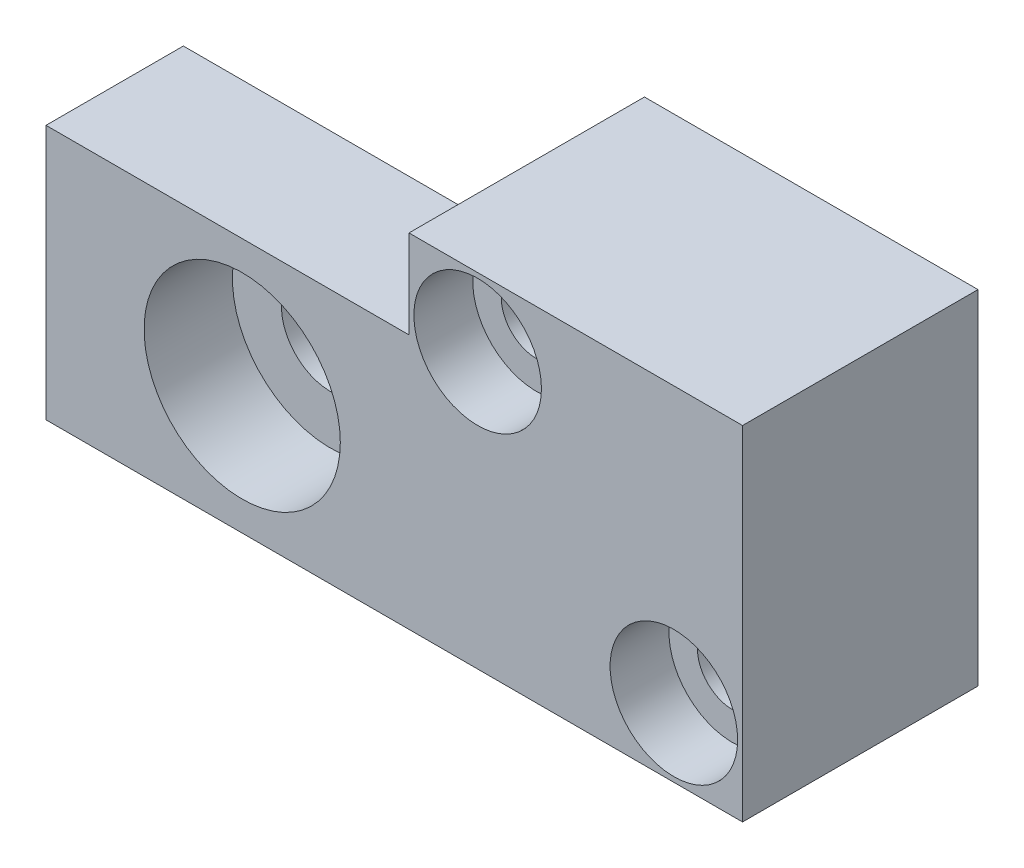
ISO-10303-21;
HEADER;
FILE_DESCRIPTION(('STEP AP214'),'2;1');
FILE_NAME('part.step','',(''),(''),'','','');
FILE_SCHEMA(('AUTOMOTIVE_DESIGN { 1 0 10303 214 1 1 1 1 }'));
ENDSEC;
DATA;
#1=APPLICATION_CONTEXT('core data for automotive mechanical design processes');
#2=APPLICATION_PROTOCOL_DEFINITION('international standard','automotive_design',2000,#1);
#3=PRODUCT_CONTEXT('',#1,'mechanical');
#4=PRODUCT('Part','Part','',(#3));
#5=PRODUCT_RELATED_PRODUCT_CATEGORY('part','',(#4));
#6=PRODUCT_DEFINITION_FORMATION('','',#4);
#7=PRODUCT_DEFINITION_CONTEXT('part definition',#1,'design');
#8=PRODUCT_DEFINITION('design','',#6,#7);
#9=PRODUCT_DEFINITION_SHAPE('','',#8);
#10=(LENGTH_UNIT() NAMED_UNIT(*) SI_UNIT(.MILLI.,.METRE.));
#11=(NAMED_UNIT(*) PLANE_ANGLE_UNIT() SI_UNIT($,.RADIAN.));
#12=(NAMED_UNIT(*) SI_UNIT($,.STERADIAN.) SOLID_ANGLE_UNIT());
#13=UNCERTAINTY_MEASURE_WITH_UNIT(LENGTH_MEASURE(1.E-05),#10,'distance_accuracy_value','');
#14=(GEOMETRIC_REPRESENTATION_CONTEXT(3) GLOBAL_UNCERTAINTY_ASSIGNED_CONTEXT((#13)) GLOBAL_UNIT_ASSIGNED_CONTEXT((#10,
#11,#12)) REPRESENTATION_CONTEXT('',''));
#15=CARTESIAN_POINT('',(0.,0.,0.));
#16=DIRECTION('',(0.,0.,1.));
#17=DIRECTION('',(1.,0.,0.));
#18=AXIS2_PLACEMENT_3D('',#15,#16,#17);
#19=CARTESIAN_POINT('',(0.,0.,12.));
#20=DIRECTION('',(1.,0.,0.));
#21=DIRECTION('',(0.,0.,-1.));
#22=AXIS2_PLACEMENT_3D('',#19,#20,#21);
#23=PLANE('',#22);
#24=DIRECTION('',(0.,1.,0.));
#25=VECTOR('',#24,1.);
#26=CARTESIAN_POINT('',(0.,0.,5.));
#27=LINE('',#26,#25);
#28=CARTESIAN_POINT('',(0.,0.,5.));
#29=VERTEX_POINT('',#28);
#30=CARTESIAN_POINT('',(0.,13.,5.));
#31=VERTEX_POINT('',#30);
#32=EDGE_CURVE('E50',#29,#31,#27,.T.);
#33=ORIENTED_EDGE('',*,*,#32,.F.);
#34=DIRECTION('',(0.,0.,-1.));
#35=VECTOR('',#34,1.);
#36=CARTESIAN_POINT('',(0.,0.,12.));
#37=LINE('',#36,#35);
#38=CARTESIAN_POINT('',(0.,0.,12.));
#39=VERTEX_POINT('',#38);
#40=EDGE_CURVE('E11',#39,#29,#37,.T.);
#41=ORIENTED_EDGE('',*,*,#40,.F.);
#42=DIRECTION('',(0.,-1.,0.));
#43=VECTOR('',#42,1.);
#44=CARTESIAN_POINT('',(0.,0.,12.));
#45=LINE('',#44,#43);
#46=CARTESIAN_POINT('',(0.,13.,12.));
#47=VERTEX_POINT('',#46);
#48=EDGE_CURVE('E173',#47,#39,#45,.T.);
#49=ORIENTED_EDGE('',*,*,#48,.F.);
#50=DIRECTION('',(0.,0.,1.));
#51=VECTOR('',#50,1.);
#52=CARTESIAN_POINT('',(0.,13.,0.));
#53=LINE('',#52,#51);
#54=EDGE_CURVE('E162',#31,#47,#53,.T.);
#55=ORIENTED_EDGE('',*,*,#54,.F.);
#56=EDGE_LOOP('',(#33,#41,#49,#55));
#57=FACE_BOUND('',#56,.T.);
#58=ADVANCED_FACE('F35',(#57),#23,.F.);
#59=CARTESIAN_POINT('',(10.,6.5,0.));
#60=DIRECTION('',(0.,0.,1.));
#61=DIRECTION('',(1.,0.,0.));
#62=AXIS2_PLACEMENT_3D('',#59,#60,#61);
#63=CYLINDRICAL_SURFACE('',#62,2.5);
#64=CARTESIAN_POINT('',(10.,6.5,7.5));
#65=DIRECTION('',(0.,0.,1.));
#66=DIRECTION('',(1.,0.,0.));
#67=AXIS2_PLACEMENT_3D('',#64,#65,#66);
#68=CIRCLE('',#67,2.5);
#69=CARTESIAN_POINT('',(12.5,6.5,7.5));
#70=VERTEX_POINT('',#69);
#71=EDGE_CURVE('E124',#70,#70,#68,.T.);
#72=CARTESIAN_POINT('',(10.,6.5,5.));
#73=DIRECTION('',(0.,0.,-1.));
#74=DIRECTION('',(-1.,0.,0.));
#75=AXIS2_PLACEMENT_3D('',#72,#73,#74);
#76=CIRCLE('',#75,2.5);
#77=CARTESIAN_POINT('',(12.5,6.5,5.));
#78=VERTEX_POINT('',#77);
#79=EDGE_CURVE('E38',#78,#78,#76,.F.);
#80=CARTESIAN_POINT('',(12.5,6.5,7.5));
#81=CARTESIAN_POINT('',(12.5,6.5,7.47395833333333));
#82=CARTESIAN_POINT('',(12.5,6.5,7.44791666666667));
#83=CARTESIAN_POINT('',(12.5,6.5,7.39583333333333));
#84=CARTESIAN_POINT('',(12.5,6.5,7.36979166666667));
#85=CARTESIAN_POINT('',(12.5,6.5,7.31770833333333));
#86=CARTESIAN_POINT('',(12.5,6.5,7.29166666666667));
#87=CARTESIAN_POINT('',(12.5,6.5,7.23958333333333));
#88=CARTESIAN_POINT('',(12.5,6.5,7.21354166666667));
#89=CARTESIAN_POINT('',(12.5,6.5,7.16145833333333));
#90=CARTESIAN_POINT('',(12.5,6.5,7.13541666666667));
#91=CARTESIAN_POINT('',(12.5,6.5,7.08333333333333));
#92=CARTESIAN_POINT('',(12.5,6.5,7.05729166666667));
#93=CARTESIAN_POINT('',(12.5,6.5,7.00520833333333));
#94=CARTESIAN_POINT('',(12.5,6.5,6.97916666666667));
#95=CARTESIAN_POINT('',(12.5,6.5,6.92708333333333));
#96=CARTESIAN_POINT('',(12.5,6.5,6.90104166666667));
#97=CARTESIAN_POINT('',(12.5,6.5,6.84895833333333));
#98=CARTESIAN_POINT('',(12.5,6.5,6.82291666666667));
#99=CARTESIAN_POINT('',(12.5,6.5,6.77083333333333));
#100=CARTESIAN_POINT('',(12.5,6.5,6.74479166666667));
#101=CARTESIAN_POINT('',(12.5,6.5,6.69270833333333));
#102=CARTESIAN_POINT('',(12.5,6.5,6.66666666666667));
#103=CARTESIAN_POINT('',(12.5,6.5,6.61458333333333));
#104=CARTESIAN_POINT('',(12.5,6.5,6.58854166666667));
#105=CARTESIAN_POINT('',(12.5,6.5,6.53645833333333));
#106=CARTESIAN_POINT('',(12.5,6.5,6.51041666666667));
#107=CARTESIAN_POINT('',(12.5,6.5,6.45833333333333));
#108=CARTESIAN_POINT('',(12.5,6.5,6.43229166666667));
#109=CARTESIAN_POINT('',(12.5,6.5,6.38020833333333));
#110=CARTESIAN_POINT('',(12.5,6.5,6.35416666666667));
#111=CARTESIAN_POINT('',(12.5,6.5,6.30208333333333));
#112=CARTESIAN_POINT('',(12.5,6.5,6.27604166666667));
#113=CARTESIAN_POINT('',(12.5,6.5,6.22395833333333));
#114=CARTESIAN_POINT('',(12.5,6.5,6.19791666666667));
#115=CARTESIAN_POINT('',(12.5,6.5,6.14583333333333));
#116=CARTESIAN_POINT('',(12.5,6.5,6.11979166666667));
#117=CARTESIAN_POINT('',(12.5,6.5,6.06770833333333));
#118=CARTESIAN_POINT('',(12.5,6.5,6.04166666666667));
#119=CARTESIAN_POINT('',(12.5,6.5,5.98958333333333));
#120=CARTESIAN_POINT('',(12.5,6.5,5.96354166666667));
#121=CARTESIAN_POINT('',(12.5,6.5,5.91145833333333));
#122=CARTESIAN_POINT('',(12.5,6.5,5.88541666666667));
#123=CARTESIAN_POINT('',(12.5,6.5,5.83333333333333));
#124=CARTESIAN_POINT('',(12.5,6.5,5.80729166666667));
#125=CARTESIAN_POINT('',(12.5,6.5,5.75520833333333));
#126=CARTESIAN_POINT('',(12.5,6.5,5.72916666666667));
#127=CARTESIAN_POINT('',(12.5,6.5,5.67708333333333));
#128=CARTESIAN_POINT('',(12.5,6.5,5.65104166666667));
#129=CARTESIAN_POINT('',(12.5,6.5,5.59895833333333));
#130=CARTESIAN_POINT('',(12.5,6.5,5.57291666666667));
#131=CARTESIAN_POINT('',(12.5,6.5,5.52083333333333));
#132=CARTESIAN_POINT('',(12.5,6.5,5.49479166666667));
#133=CARTESIAN_POINT('',(12.5,6.5,5.44270833333333));
#134=CARTESIAN_POINT('',(12.5,6.5,5.41666666666667));
#135=CARTESIAN_POINT('',(12.5,6.5,5.36458333333333));
#136=CARTESIAN_POINT('',(12.5,6.5,5.33854166666667));
#137=CARTESIAN_POINT('',(12.5,6.5,5.28645833333333));
#138=CARTESIAN_POINT('',(12.5,6.5,5.26041666666667));
#139=CARTESIAN_POINT('',(12.5,6.5,5.20833333333333));
#140=CARTESIAN_POINT('',(12.5,6.5,5.18229166666667));
#141=CARTESIAN_POINT('',(12.5,6.5,5.13020833333333));
#142=CARTESIAN_POINT('',(12.5,6.5,5.10416666666667));
#143=CARTESIAN_POINT('',(12.5,6.5,5.05208333333333));
#144=CARTESIAN_POINT('',(12.5,6.5,5.02604166666667));
#145=CARTESIAN_POINT('',(12.5,6.5,5.));
#146=B_SPLINE_CURVE_WITH_KNOTS('',3,(#80,#81,#82,#83,#84,#85,#86,#87,#88,#89,#90,#91,#92,#93,
#94,#95,#96,#97,#98,#99,#100,#101,#102,#103,#104,#105,#106,#107,#108,#109,#110,#111,#112,#113,
#114,#115,#116,#117,#118,#119,#120,#121,#122,#123,#124,#125,#126,#127,#128,#129,#130,#131,#132,
#133,#134,#135,#136,#137,#138,#139,#140,#141,#142,#143,#144,#145),.UNSPECIFIED.,.F.,.F.,(4,2,2,
2,2,2,2,2,2,2,2,2,2,2,2,2,2,2,2,2,2,2,2,2,2,2,2,2,2,2,2,2,4),(0.,0.0781250000000001,0.15625,
0.234375,0.3125,0.390625,0.46875,0.546875,0.625000000000001,0.703125000000001,0.78125,0.859375,
0.9375,1.015625,1.09375,1.171875,1.25,1.328125,1.40625,1.484375,1.5625,1.640625,1.71875,
1.796875,1.875,1.953125,2.03125,2.109375,2.1875,2.265625,2.34375,2.421875,2.5),.UNSPECIFIED.);
#147=EDGE_CURVE('BSEAM230',#70,#78,#146,.T.);
#148=ORIENTED_EDGE('',*,*,#71,.T.);
#149=ORIENTED_EDGE('',*,*,#79,.F.);
#150=ORIENTED_EDGE('',*,*,#147,.T.);
#151=ORIENTED_EDGE('',*,*,#147,.F.);
#152=EDGE_LOOP('',(#148,#150,#149,#151));
#153=FACE_BOUND('',#152,.T.);
#154=ADVANCED_FACE('F230',(#153),#63,.F.);
#155=CARTESIAN_POINT('',(0.,0.,12.));
#156=DIRECTION('',(0.,1.,0.));
#157=DIRECTION('',(0.,0.,1.));
#158=AXIS2_PLACEMENT_3D('',#155,#156,#157);
#159=PLANE('',#158);
#160=DIRECTION('',(-1.,0.,0.));
#161=VECTOR('',#160,1.);
#162=CARTESIAN_POINT('',(0.,0.,5.));
#163=LINE('',#162,#161);
#164=CARTESIAN_POINT('',(17.,0.,5.));
#165=VERTEX_POINT('',#164);
#166=EDGE_CURVE('E109',#165,#29,#163,.T.);
#167=ORIENTED_EDGE('',*,*,#166,.F.);
#168=DIRECTION('',(0.,0.,-1.));
#169=VECTOR('',#168,1.);
#170=CARTESIAN_POINT('',(17.,0.,5.));
#171=LINE('',#170,#169);
#172=CARTESIAN_POINT('',(17.,0.,0.));
#173=VERTEX_POINT('',#172);
#174=EDGE_CURVE('E107',#165,#173,#171,.T.);
#175=ORIENTED_EDGE('',*,*,#174,.T.);
#176=DIRECTION('',(1.,0.,0.));
#177=VECTOR('',#176,1.);
#178=CARTESIAN_POINT('',(0.,0.,0.));
#179=LINE('',#178,#177);
#180=CARTESIAN_POINT('',(35.5,0.,0.));
#181=VERTEX_POINT('',#180);
#182=EDGE_CURVE('E169',#173,#181,#179,.T.);
#183=ORIENTED_EDGE('',*,*,#182,.T.);
#184=DIRECTION('',(0.,0.,-1.));
#185=VECTOR('',#184,1.);
#186=CARTESIAN_POINT('',(35.5,0.,12.));
#187=LINE('',#186,#185);
#188=CARTESIAN_POINT('',(35.5,0.,12.));
#189=VERTEX_POINT('',#188);
#190=EDGE_CURVE('E43',#189,#181,#187,.T.);
#191=ORIENTED_EDGE('',*,*,#190,.F.);
#192=DIRECTION('',(1.,0.,0.));
#193=VECTOR('',#192,1.);
#194=CARTESIAN_POINT('',(0.,0.,12.));
#195=LINE('',#194,#193);
#196=EDGE_CURVE('E175',#39,#189,#195,.T.);
#197=ORIENTED_EDGE('',*,*,#196,.F.);
#198=ORIENTED_EDGE('',*,*,#40,.T.);
#199=EDGE_LOOP('',(#167,#175,#183,#191,#197,#198));
#200=FACE_BOUND('',#199,.T.);
#201=ADVANCED_FACE('F213',(#200),#159,.F.);
#202=CARTESIAN_POINT('',(35.5,0.,12.));
#203=DIRECTION('',(-1.,0.,0.));
#204=DIRECTION('',(0.,0.,1.));
#205=AXIS2_PLACEMENT_3D('',#202,#203,#204);
#206=PLANE('',#205);
#207=DIRECTION('',(0.,1.,0.));
#208=VECTOR('',#207,1.);
#209=CARTESIAN_POINT('',(35.5,0.,0.));
#210=LINE('',#209,#208);
#211=CARTESIAN_POINT('',(35.5,17.5,0.));
#212=VERTEX_POINT('',#211);
#213=EDGE_CURVE('E185',#181,#212,#210,.T.);
#214=ORIENTED_EDGE('',*,*,#213,.T.);
#215=DIRECTION('',(0.,0.,-1.));
#216=VECTOR('',#215,1.);
#217=CARTESIAN_POINT('',(35.5,17.5,12.));
#218=LINE('',#217,#216);
#219=CARTESIAN_POINT('',(35.5,17.5,12.));
#220=VERTEX_POINT('',#219);
#221=EDGE_CURVE('E183',#220,#212,#218,.T.);
#222=ORIENTED_EDGE('',*,*,#221,.F.);
#223=DIRECTION('',(0.,1.,0.));
#224=VECTOR('',#223,1.);
#225=CARTESIAN_POINT('',(35.5,0.,12.));
#226=LINE('',#225,#224);
#227=EDGE_CURVE('E178',#189,#220,#226,.T.);
#228=ORIENTED_EDGE('',*,*,#227,.F.);
#229=ORIENTED_EDGE('',*,*,#190,.T.);
#230=EDGE_LOOP('',(#214,#222,#228,#229));
#231=FACE_BOUND('',#230,.T.);
#232=ADVANCED_FACE('F196',(#231),#206,.F.);
#233=CARTESIAN_POINT('',(0.,17.5,12.));
#234=DIRECTION('',(0.,-1.,0.));
#235=DIRECTION('',(0.,0.,-1.));
#236=AXIS2_PLACEMENT_3D('',#233,#234,#235);
#237=PLANE('',#236);
#238=DIRECTION('',(-1.,0.,0.));
#239=VECTOR('',#238,1.);
#240=CARTESIAN_POINT('',(0.,17.5,0.));
#241=LINE('',#240,#239);
#242=CARTESIAN_POINT('',(18.5,17.5,0.));
#243=VERTEX_POINT('',#242);
#244=EDGE_CURVE('E176',#212,#243,#241,.T.);
#245=ORIENTED_EDGE('',*,*,#244,.T.);
#246=DIRECTION('',(0.,0.,1.));
#247=VECTOR('',#246,1.);
#248=CARTESIAN_POINT('',(18.5,17.5,0.));
#249=LINE('',#248,#247);
#250=CARTESIAN_POINT('',(18.5,17.5,12.));
#251=VERTEX_POINT('',#250);
#252=EDGE_CURVE('E166',#243,#251,#249,.T.);
#253=ORIENTED_EDGE('',*,*,#252,.T.);
#254=DIRECTION('',(-1.,0.,0.));
#255=VECTOR('',#254,1.);
#256=CARTESIAN_POINT('',(0.,17.5,12.));
#257=LINE('',#256,#255);
#258=EDGE_CURVE('E180',#220,#251,#257,.T.);
#259=ORIENTED_EDGE('',*,*,#258,.F.);
#260=ORIENTED_EDGE('',*,*,#221,.T.);
#261=EDGE_LOOP('',(#245,#253,#259,#260));
#262=FACE_BOUND('',#261,.T.);
#263=ADVANCED_FACE('F205',(#262),#237,.F.);
#264=CARTESIAN_POINT('',(0.,17.5,12.));
#265=DIRECTION('',(0.,0.,-1.));
#266=DIRECTION('',(-1.,0.,0.));
#267=AXIS2_PLACEMENT_3D('',#264,#265,#266);
#268=PLANE('',#267);
#269=CARTESIAN_POINT('',(22.,14.,12.));
#270=DIRECTION('',(0.,0.,1.));
#271=DIRECTION('',(1.,0.,0.));
#272=AXIS2_PLACEMENT_3D('',#269,#270,#271);
#273=CIRCLE('',#272,3.25);
#274=CARTESIAN_POINT('',(25.25,14.,12.));
#275=VERTEX_POINT('',#274);
#276=EDGE_CURVE('E127',#275,#275,#273,.T.);
#277=ORIENTED_EDGE('',*,*,#276,.F.);
#278=EDGE_LOOP('',(#277));
#279=FACE_BOUND('',#278,.T.);
#280=CARTESIAN_POINT('',(32.,3.50000000000001,12.));
#281=DIRECTION('',(0.,0.,1.));
#282=DIRECTION('',(1.,0.,0.));
#283=AXIS2_PLACEMENT_3D('',#280,#281,#282);
#284=CIRCLE('',#283,3.25);
#285=CARTESIAN_POINT('',(35.25,3.50000000000001,12.));
#286=VERTEX_POINT('',#285);
#287=EDGE_CURVE('E139',#286,#286,#284,.T.);
#288=ORIENTED_EDGE('',*,*,#287,.F.);
#289=EDGE_LOOP('',(#288));
#290=FACE_BOUND('',#289,.T.);
#291=CARTESIAN_POINT('',(10.,6.5,12.));
#292=DIRECTION('',(0.,0.,1.));
#293=DIRECTION('',(1.,0.,0.));
#294=AXIS2_PLACEMENT_3D('',#291,#292,#293);
#295=CIRCLE('',#294,5.);
#296=CARTESIAN_POINT('',(15.,6.5,12.));
#297=VERTEX_POINT('',#296);
#298=EDGE_CURVE('E151',#297,#297,#295,.T.);
#299=ORIENTED_EDGE('',*,*,#298,.F.);
#300=EDGE_LOOP('',(#299));
#301=FACE_BOUND('',#300,.T.);
#302=ORIENTED_EDGE('',*,*,#258,.T.);
#303=DIRECTION('',(0.,1.,0.));
#304=VECTOR('',#303,1.);
#305=CARTESIAN_POINT('',(18.5,17.5,12.));
#306=LINE('',#305,#304);
#307=CARTESIAN_POINT('',(18.5,13.,12.));
#308=VERTEX_POINT('',#307);
#309=EDGE_CURVE('E160',#308,#251,#306,.T.);
#310=ORIENTED_EDGE('',*,*,#309,.F.);
#311=DIRECTION('',(1.,0.,0.));
#312=VECTOR('',#311,1.);
#313=CARTESIAN_POINT('',(0.,13.,12.));
#314=LINE('',#313,#312);
#315=EDGE_CURVE('E155',#47,#308,#314,.T.);
#316=ORIENTED_EDGE('',*,*,#315,.F.);
#317=ORIENTED_EDGE('',*,*,#48,.T.);
#318=ORIENTED_EDGE('',*,*,#196,.T.);
#319=ORIENTED_EDGE('',*,*,#227,.T.);
#320=EDGE_LOOP('',(#302,#310,#316,#317,#318,#319));
#321=FACE_BOUND('',#320,.T.);
#322=ADVANCED_FACE('F209',(#279,#290,#301,#321),#268,.F.);
#323=CARTESIAN_POINT('',(0.,17.5,0.));
#324=DIRECTION('',(0.,0.,-1.));
#325=DIRECTION('',(-1.,0.,0.));
#326=AXIS2_PLACEMENT_3D('',#323,#324,#325);
#327=PLANE('',#326);
#328=DIRECTION('',(0.,-1.,0.));
#329=VECTOR('',#328,1.);
#330=CARTESIAN_POINT('',(17.,0.,0.));
#331=LINE('',#330,#329);
#332=CARTESIAN_POINT('',(17.,13.,0.));
#333=VERTEX_POINT('',#332);
#334=EDGE_CURVE('E215',#333,#173,#331,.T.);
#335=ORIENTED_EDGE('',*,*,#334,.F.);
#336=DIRECTION('',(1.,0.,0.));
#337=VECTOR('',#336,1.);
#338=CARTESIAN_POINT('',(0.,13.,0.));
#339=LINE('',#338,#337);
#340=CARTESIAN_POINT('',(18.5,13.,0.));
#341=VERTEX_POINT('',#340);
#342=EDGE_CURVE('E58',#333,#341,#339,.T.);
#343=ORIENTED_EDGE('',*,*,#342,.T.);
#344=DIRECTION('',(0.,1.,0.));
#345=VECTOR('',#344,1.);
#346=CARTESIAN_POINT('',(18.5,17.5,0.));
#347=LINE('',#346,#345);
#348=EDGE_CURVE('E159',#341,#243,#347,.T.);
#349=ORIENTED_EDGE('',*,*,#348,.T.);
#350=ORIENTED_EDGE('',*,*,#244,.F.);
#351=ORIENTED_EDGE('',*,*,#213,.F.);
#352=ORIENTED_EDGE('',*,*,#182,.F.);
#353=EDGE_LOOP('',(#335,#343,#349,#350,#351,#352));
#354=FACE_BOUND('',#353,.T.);
#355=CARTESIAN_POINT('',(22.,14.,0.));
#356=DIRECTION('',(0.,0.,1.));
#357=DIRECTION('',(1.,0.,0.));
#358=AXIS2_PLACEMENT_3D('',#355,#356,#357);
#359=CIRCLE('',#358,1.8);
#360=CARTESIAN_POINT('',(23.8,14.,0.));
#361=VERTEX_POINT('',#360);
#362=EDGE_CURVE('E136',#361,#361,#359,.T.);
#363=ORIENTED_EDGE('',*,*,#362,.T.);
#364=EDGE_LOOP('',(#363));
#365=FACE_BOUND('',#364,.T.);
#366=CARTESIAN_POINT('',(32.,3.50000000000001,0.));
#367=DIRECTION('',(0.,0.,1.));
#368=DIRECTION('',(1.,0.,0.));
#369=AXIS2_PLACEMENT_3D('',#366,#367,#368);
#370=CIRCLE('',#369,1.8);
#371=CARTESIAN_POINT('',(33.8,3.50000000000001,0.));
#372=VERTEX_POINT('',#371);
#373=EDGE_CURVE('E148',#372,#372,#370,.T.);
#374=ORIENTED_EDGE('',*,*,#373,.T.);
#375=EDGE_LOOP('',(#374));
#376=FACE_BOUND('',#375,.T.);
#377=ADVANCED_FACE('F202',(#354,#365,#376),#327,.T.);
#378=CARTESIAN_POINT('',(18.5,17.5,0.));
#379=DIRECTION('',(1.,0.,0.));
#380=DIRECTION('',(0.,1.,0.));
#381=AXIS2_PLACEMENT_3D('',#378,#379,#380);
#382=PLANE('',#381);
#383=ORIENTED_EDGE('',*,*,#309,.T.);
#384=ORIENTED_EDGE('',*,*,#252,.F.);
#385=ORIENTED_EDGE('',*,*,#348,.F.);
#386=DIRECTION('',(0.,0.,1.));
#387=VECTOR('',#386,1.);
#388=CARTESIAN_POINT('',(18.5,13.,0.));
#389=LINE('',#388,#387);
#390=EDGE_CURVE('E170',#341,#308,#389,.T.);
#391=ORIENTED_EDGE('',*,*,#390,.T.);
#392=EDGE_LOOP('',(#383,#384,#385,#391));
#393=FACE_BOUND('',#392,.T.);
#394=ADVANCED_FACE('F218',(#393),#382,.F.);
#395=CARTESIAN_POINT('',(0.,13.,0.));
#396=DIRECTION('',(0.,-1.,0.));
#397=DIRECTION('',(0.,0.,-1.));
#398=AXIS2_PLACEMENT_3D('',#395,#396,#397);
#399=PLANE('',#398);
#400=ORIENTED_EDGE('',*,*,#342,.F.);
#401=DIRECTION('',(0.,0.,-1.));
#402=VECTOR('',#401,1.);
#403=CARTESIAN_POINT('',(17.,13.,5.));
#404=LINE('',#403,#402);
#405=CARTESIAN_POINT('',(17.,13.,5.));
#406=VERTEX_POINT('',#405);
#407=EDGE_CURVE('E105',#406,#333,#404,.T.);
#408=ORIENTED_EDGE('',*,*,#407,.F.);
#409=DIRECTION('',(1.,0.,0.));
#410=VECTOR('',#409,1.);
#411=CARTESIAN_POINT('',(0.,13.,5.));
#412=LINE('',#411,#410);
#413=EDGE_CURVE('E110',#31,#406,#412,.T.);
#414=ORIENTED_EDGE('',*,*,#413,.F.);
#415=ORIENTED_EDGE('',*,*,#54,.T.);
#416=ORIENTED_EDGE('',*,*,#315,.T.);
#417=ORIENTED_EDGE('',*,*,#390,.F.);
#418=EDGE_LOOP('',(#400,#408,#414,#415,#416,#417));
#419=FACE_BOUND('',#418,.T.);
#420=ADVANCED_FACE('F117',(#419),#399,.F.);
#421=CARTESIAN_POINT('',(10.,6.5,7.5));
#422=DIRECTION('',(0.,0.,1.));
#423=DIRECTION('',(1.,0.,0.));
#424=AXIS2_PLACEMENT_3D('',#421,#422,#423);
#425=CYLINDRICAL_SURFACE('',#424,5.);
#426=CARTESIAN_POINT('',(10.,6.5,7.5));
#427=DIRECTION('',(0.,0.,1.));
#428=DIRECTION('',(1.,0.,0.));
#429=AXIS2_PLACEMENT_3D('',#426,#427,#428);
#430=CIRCLE('',#429,5.);
#431=CARTESIAN_POINT('',(15.,6.5,7.5));
#432=VERTEX_POINT('',#431);
#433=EDGE_CURVE('E152',#432,#432,#430,.T.);
#434=ORIENTED_EDGE('',*,*,#433,.F.);
#435=EDGE_LOOP('',(#434));
#436=FACE_BOUND('',#435,.T.);
#437=ORIENTED_EDGE('',*,*,#298,.T.);
#438=EDGE_LOOP('',(#437));
#439=FACE_BOUND('',#438,.T.);
#440=ADVANCED_FACE('F225',(#436,#439),#425,.F.);
#441=CARTESIAN_POINT('',(10.,6.5,7.5));
#442=DIRECTION('',(0.,0.,1.));
#443=DIRECTION('',(1.,0.,0.));
#444=AXIS2_PLACEMENT_3D('',#441,#442,#443);
#445=PLANE('',#444);
#446=ORIENTED_EDGE('',*,*,#71,.F.);
#447=EDGE_LOOP('',(#446));
#448=FACE_BOUND('',#447,.T.);
#449=ORIENTED_EDGE('',*,*,#433,.T.);
#450=EDGE_LOOP('',(#449));
#451=FACE_BOUND('',#450,.T.);
#452=ADVANCED_FACE('F266',(#448,#451),#445,.T.);
#453=CARTESIAN_POINT('',(32.,3.50000000000001,12.));
#454=DIRECTION('',(0.,0.,1.));
#455=DIRECTION('',(1.,0.,0.));
#456=AXIS2_PLACEMENT_3D('',#453,#454,#455);
#457=CYLINDRICAL_SURFACE('',#456,1.8);
#458=ORIENTED_EDGE('',*,*,#373,.F.);
#459=EDGE_LOOP('',(#458));
#460=FACE_BOUND('',#459,.T.);
#461=CARTESIAN_POINT('',(32.,3.50000000000001,9.));
#462=DIRECTION('',(0.,0.,1.));
#463=DIRECTION('',(1.,0.,0.));
#464=AXIS2_PLACEMENT_3D('',#461,#462,#463);
#465=CIRCLE('',#464,1.8);
#466=CARTESIAN_POINT('',(33.8,3.50000000000001,9.));
#467=VERTEX_POINT('',#466);
#468=EDGE_CURVE('E145',#467,#467,#465,.T.);
#469=ORIENTED_EDGE('',*,*,#468,.T.);
#470=EDGE_LOOP('',(#469));
#471=FACE_BOUND('',#470,.T.);
#472=ADVANCED_FACE('F262',(#460,#471),#457,.F.);
#473=CARTESIAN_POINT('',(33.8,3.50000000000001,9.));
#474=DIRECTION('',(0.,0.,-1.));
#475=DIRECTION('',(-1.,0.,0.));
#476=AXIS2_PLACEMENT_3D('',#473,#474,#475);
#477=PLANE('',#476);
#478=ORIENTED_EDGE('',*,*,#468,.F.);
#479=EDGE_LOOP('',(#478));
#480=FACE_BOUND('',#479,.T.);
#481=CARTESIAN_POINT('',(32.,3.50000000000001,9.));
#482=DIRECTION('',(0.,0.,1.));
#483=DIRECTION('',(1.,0.,0.));
#484=AXIS2_PLACEMENT_3D('',#481,#482,#483);
#485=CIRCLE('',#484,3.25);
#486=CARTESIAN_POINT('',(35.25,3.50000000000001,9.));
#487=VERTEX_POINT('',#486);
#488=EDGE_CURVE('E142',#487,#487,#485,.T.);
#489=ORIENTED_EDGE('',*,*,#488,.T.);
#490=EDGE_LOOP('',(#489));
#491=FACE_BOUND('',#490,.T.);
#492=ADVANCED_FACE('F258',(#480,#491),#477,.F.);
#493=CARTESIAN_POINT('',(32.,3.50000000000001,12.));
#494=DIRECTION('',(0.,0.,1.));
#495=DIRECTION('',(1.,0.,0.));
#496=AXIS2_PLACEMENT_3D('',#493,#494,#495);
#497=CYLINDRICAL_SURFACE('',#496,3.25);
#498=ORIENTED_EDGE('',*,*,#488,.F.);
#499=EDGE_LOOP('',(#498));
#500=FACE_BOUND('',#499,.T.);
#501=ORIENTED_EDGE('',*,*,#287,.T.);
#502=EDGE_LOOP('',(#501));
#503=FACE_BOUND('',#502,.T.);
#504=ADVANCED_FACE('F254',(#500,#503),#497,.F.);
#505=CARTESIAN_POINT('',(22.,14.,12.));
#506=DIRECTION('',(0.,0.,1.));
#507=DIRECTION('',(1.,0.,0.));
#508=AXIS2_PLACEMENT_3D('',#505,#506,#507);
#509=CYLINDRICAL_SURFACE('',#508,1.8);
#510=ORIENTED_EDGE('',*,*,#362,.F.);
#511=EDGE_LOOP('',(#510));
#512=FACE_BOUND('',#511,.T.);
#513=CARTESIAN_POINT('',(22.,14.,9.));
#514=DIRECTION('',(0.,0.,1.));
#515=DIRECTION('',(1.,0.,0.));
#516=AXIS2_PLACEMENT_3D('',#513,#514,#515);
#517=CIRCLE('',#516,1.8);
#518=CARTESIAN_POINT('',(23.8,14.,9.));
#519=VERTEX_POINT('',#518);
#520=EDGE_CURVE('E133',#519,#519,#517,.T.);
#521=ORIENTED_EDGE('',*,*,#520,.T.);
#522=EDGE_LOOP('',(#521));
#523=FACE_BOUND('',#522,.T.);
#524=ADVANCED_FACE('F250',(#512,#523),#509,.F.);
#525=CARTESIAN_POINT('',(23.8,14.,9.));
#526=DIRECTION('',(0.,0.,-1.));
#527=DIRECTION('',(-1.,0.,0.));
#528=AXIS2_PLACEMENT_3D('',#525,#526,#527);
#529=PLANE('',#528);
#530=ORIENTED_EDGE('',*,*,#520,.F.);
#531=EDGE_LOOP('',(#530));
#532=FACE_BOUND('',#531,.T.);
#533=CARTESIAN_POINT('',(22.,14.,9.));
#534=DIRECTION('',(0.,0.,1.));
#535=DIRECTION('',(1.,0.,0.));
#536=AXIS2_PLACEMENT_3D('',#533,#534,#535);
#537=CIRCLE('',#536,3.25);
#538=CARTESIAN_POINT('',(25.25,14.,9.));
#539=VERTEX_POINT('',#538);
#540=EDGE_CURVE('E130',#539,#539,#537,.T.);
#541=ORIENTED_EDGE('',*,*,#540,.T.);
#542=EDGE_LOOP('',(#541));
#543=FACE_BOUND('',#542,.T.);
#544=ADVANCED_FACE('F246',(#532,#543),#529,.F.);
#545=CARTESIAN_POINT('',(22.,14.,12.));
#546=DIRECTION('',(0.,0.,1.));
#547=DIRECTION('',(1.,0.,0.));
#548=AXIS2_PLACEMENT_3D('',#545,#546,#547);
#549=CYLINDRICAL_SURFACE('',#548,3.25);
#550=ORIENTED_EDGE('',*,*,#540,.F.);
#551=EDGE_LOOP('',(#550));
#552=FACE_BOUND('',#551,.T.);
#553=ORIENTED_EDGE('',*,*,#276,.T.);
#554=EDGE_LOOP('',(#553));
#555=FACE_BOUND('',#554,.T.);
#556=ADVANCED_FACE('F243',(#552,#555),#549,.F.);
#557=CARTESIAN_POINT('',(0.,13.,5.));
#558=DIRECTION('',(0.,0.,-1.));
#559=DIRECTION('',(-1.,0.,0.));
#560=AXIS2_PLACEMENT_3D('',#557,#558,#559);
#561=PLANE('',#560);
#562=ORIENTED_EDGE('',*,*,#32,.T.);
#563=ORIENTED_EDGE('',*,*,#413,.T.);
#564=DIRECTION('',(0.,-1.,0.));
#565=VECTOR('',#564,1.);
#566=CARTESIAN_POINT('',(17.,0.,5.));
#567=LINE('',#566,#565);
#568=EDGE_CURVE('E102',#406,#165,#567,.T.);
#569=ORIENTED_EDGE('',*,*,#568,.T.);
#570=ORIENTED_EDGE('',*,*,#166,.T.);
#571=EDGE_LOOP('',(#562,#563,#569,#570));
#572=FACE_BOUND('',#571,.T.);
#573=ORIENTED_EDGE('',*,*,#79,.T.);
#574=EDGE_LOOP('',(#573));
#575=FACE_BOUND('',#574,.T.);
#576=ADVANCED_FACE('F112',(#572,#575),#561,.T.);
#577=CARTESIAN_POINT('',(17.,0.,5.));
#578=DIRECTION('',(1.,0.,0.));
#579=DIRECTION('',(0.,0.,-1.));
#580=AXIS2_PLACEMENT_3D('',#577,#578,#579);
#581=PLANE('',#580);
#582=ORIENTED_EDGE('',*,*,#334,.T.);
#583=ORIENTED_EDGE('',*,*,#174,.F.);
#584=ORIENTED_EDGE('',*,*,#568,.F.);
#585=ORIENTED_EDGE('',*,*,#407,.T.);
#586=EDGE_LOOP('',(#582,#583,#584,#585));
#587=FACE_BOUND('',#586,.T.);
#588=ADVANCED_FACE('F103',(#587),#581,.F.);
#589=CLOSED_SHELL('',(#58,#154,#201,#232,#263,#322,#377,#394,#420,#440,#452,#472,#492,#504,#524,
#544,#556,#576,#588));
#590=MANIFOLD_SOLID_BREP('B2',#589);
#591=ADVANCED_BREP_SHAPE_REPRESENTATION('',(#18,#590),#14);
#592=SHAPE_DEFINITION_REPRESENTATION(#9,#591);
ENDSEC;
END-ISO-10303-21;
